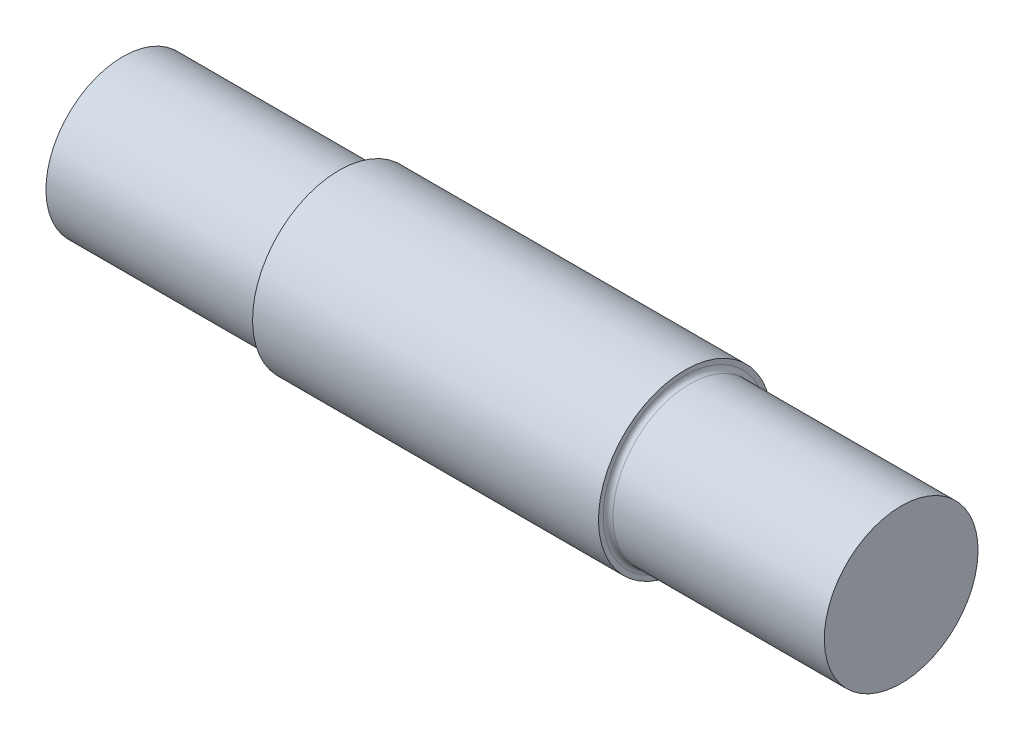
ISO-10303-21;
HEADER;
FILE_DESCRIPTION(('STEP AP214'),'2;1');
FILE_NAME('part.step','',(''),(''),'','','');
FILE_SCHEMA(('AUTOMOTIVE_DESIGN { 1 0 10303 214 1 1 1 1 }'));
ENDSEC;
DATA;
#1=APPLICATION_CONTEXT('core data for automotive mechanical design processes');
#2=APPLICATION_PROTOCOL_DEFINITION('international standard','automotive_design',2000,#1);
#3=PRODUCT_CONTEXT('',#1,'mechanical');
#4=PRODUCT('Part','Part','',(#3));
#5=PRODUCT_RELATED_PRODUCT_CATEGORY('part','',(#4));
#6=PRODUCT_DEFINITION_FORMATION('','',#4);
#7=PRODUCT_DEFINITION_CONTEXT('part definition',#1,'design');
#8=PRODUCT_DEFINITION('design','',#6,#7);
#9=PRODUCT_DEFINITION_SHAPE('','',#8);
#10=(LENGTH_UNIT() NAMED_UNIT(*) SI_UNIT(.MILLI.,.METRE.));
#11=(NAMED_UNIT(*) PLANE_ANGLE_UNIT() SI_UNIT($,.RADIAN.));
#12=(NAMED_UNIT(*) SI_UNIT($,.STERADIAN.) SOLID_ANGLE_UNIT());
#13=UNCERTAINTY_MEASURE_WITH_UNIT(LENGTH_MEASURE(1.E-05),#10,'distance_accuracy_value','');
#14=(GEOMETRIC_REPRESENTATION_CONTEXT(3) GLOBAL_UNCERTAINTY_ASSIGNED_CONTEXT((#13)) GLOBAL_UNIT_ASSIGNED_CONTEXT((#10,
#11,#12)) REPRESENTATION_CONTEXT('',''));
#15=CARTESIAN_POINT('',(0.,0.,0.));
#16=DIRECTION('',(0.,0.,1.));
#17=DIRECTION('',(1.,0.,0.));
#18=AXIS2_PLACEMENT_3D('',#15,#16,#17);
#19=CARTESIAN_POINT('',(0.,0.,0.));
#20=DIRECTION('',(-1.,0.,0.));
#21=DIRECTION('',(0.,-1.,0.));
#22=AXIS2_PLACEMENT_3D('',#19,#20,#21);
#23=PLANE('',#22);
#24=CARTESIAN_POINT('',(0.,0.,0.));
#25=DIRECTION('',(1.,0.,0.));
#26=DIRECTION('',(0.,1.,0.));
#27=AXIS2_PLACEMENT_3D('',#24,#25,#26);
#28=CIRCLE('',#27,8.);
#29=CARTESIAN_POINT('',(0.,8.,0.));
#30=VERTEX_POINT('',#29);
#31=EDGE_CURVE('E53',#30,#30,#28,.T.);
#32=ORIENTED_EDGE('',*,*,#31,.F.);
#33=EDGE_LOOP('',(#32));
#34=FACE_BOUND('',#33,.T.);
#35=ADVANCED_FACE('F33',(#34),#23,.T.);
#36=CARTESIAN_POINT('',(81.,0.,0.));
#37=DIRECTION('',(1.,0.,0.));
#38=DIRECTION('',(0.,1.,0.));
#39=AXIS2_PLACEMENT_3D('',#36,#37,#38);
#40=CYLINDRICAL_SURFACE('',#39,8.);
#41=CARTESIAN_POINT('',(22.,0.,0.));
#42=DIRECTION('',(-1.,0.,0.));
#43=DIRECTION('',(0.,-1.,0.));
#44=AXIS2_PLACEMENT_3D('',#41,#42,#43);
#45=CIRCLE('',#44,8.);
#46=CARTESIAN_POINT('',(22.,-8.,0.));
#47=VERTEX_POINT('',#46);
#48=EDGE_CURVE('E44',#47,#47,#45,.T.);
#49=ORIENTED_EDGE('',*,*,#48,.T.);
#50=EDGE_LOOP('',(#49));
#51=FACE_BOUND('',#50,.T.);
#52=ORIENTED_EDGE('',*,*,#31,.T.);
#53=EDGE_LOOP('',(#52));
#54=FACE_BOUND('',#53,.T.);
#55=ADVANCED_FACE('F81',(#51,#54),#40,.T.);
#56=CARTESIAN_POINT('',(22.5,8.,0.));
#57=DIRECTION('',(-1.,0.,0.));
#58=DIRECTION('',(0.,-1.,0.));
#59=AXIS2_PLACEMENT_3D('',#56,#57,#58);
#60=PLANE('',#59);
#61=CARTESIAN_POINT('',(22.5,0.,0.));
#62=DIRECTION('',(-1.,0.,0.));
#63=DIRECTION('',(0.,-1.,0.));
#64=AXIS2_PLACEMENT_3D('',#61,#62,#63);
#65=CIRCLE('',#64,8.5);
#66=CARTESIAN_POINT('',(22.5,-8.5,0.));
#67=VERTEX_POINT('',#66);
#68=EDGE_CURVE('E48',#67,#67,#65,.F.);
#69=ORIENTED_EDGE('',*,*,#68,.T.);
#70=EDGE_LOOP('',(#69));
#71=FACE_BOUND('',#70,.T.);
#72=CARTESIAN_POINT('',(22.5,0.,0.));
#73=DIRECTION('',(1.,0.,0.));
#74=DIRECTION('',(0.,1.,0.));
#75=AXIS2_PLACEMENT_3D('',#72,#73,#74);
#76=CIRCLE('',#75,9.);
#77=CARTESIAN_POINT('',(22.5,9.,0.));
#78=VERTEX_POINT('',#77);
#79=EDGE_CURVE('E56',#78,#78,#76,.T.);
#80=ORIENTED_EDGE('',*,*,#79,.F.);
#81=EDGE_LOOP('',(#80));
#82=FACE_BOUND('',#81,.T.);
#83=ADVANCED_FACE('F87',(#71,#82),#60,.T.);
#84=CARTESIAN_POINT('',(81.,0.,0.));
#85=DIRECTION('',(1.,0.,0.));
#86=DIRECTION('',(0.,1.,0.));
#87=AXIS2_PLACEMENT_3D('',#84,#85,#86);
#88=CYLINDRICAL_SURFACE('',#87,9.);
#89=ORIENTED_EDGE('',*,*,#79,.T.);
#90=EDGE_LOOP('',(#89));
#91=FACE_BOUND('',#90,.T.);
#92=CARTESIAN_POINT('',(58.5,0.,0.));
#93=DIRECTION('',(1.,0.,0.));
#94=DIRECTION('',(0.,1.,0.));
#95=AXIS2_PLACEMENT_3D('',#92,#93,#94);
#96=CIRCLE('',#95,9.);
#97=CARTESIAN_POINT('',(58.5,9.,0.));
#98=VERTEX_POINT('',#97);
#99=EDGE_CURVE('E59',#98,#98,#96,.T.);
#100=ORIENTED_EDGE('',*,*,#99,.F.);
#101=EDGE_LOOP('',(#100));
#102=FACE_BOUND('',#101,.T.);
#103=ADVANCED_FACE('F78',(#91,#102),#88,.T.);
#104=CARTESIAN_POINT('',(58.5,9.,0.));
#105=DIRECTION('',(1.,0.,0.));
#106=DIRECTION('',(0.,1.,0.));
#107=AXIS2_PLACEMENT_3D('',#104,#105,#106);
#108=PLANE('',#107);
#109=CARTESIAN_POINT('',(58.5,0.,0.));
#110=DIRECTION('',(1.,0.,0.));
#111=DIRECTION('',(0.,1.,0.));
#112=AXIS2_PLACEMENT_3D('',#109,#110,#111);
#113=CIRCLE('',#112,8.5);
#114=CARTESIAN_POINT('',(58.5,8.5,0.));
#115=VERTEX_POINT('',#114);
#116=EDGE_CURVE('E10',#115,#115,#113,.F.);
#117=ORIENTED_EDGE('',*,*,#116,.T.);
#118=EDGE_LOOP('',(#117));
#119=FACE_BOUND('',#118,.T.);
#120=ORIENTED_EDGE('',*,*,#99,.T.);
#121=EDGE_LOOP('',(#120));
#122=FACE_BOUND('',#121,.T.);
#123=ADVANCED_FACE('F70',(#119,#122),#108,.T.);
#124=CARTESIAN_POINT('',(81.,0.,0.));
#125=DIRECTION('',(1.,0.,0.));
#126=DIRECTION('',(0.,1.,0.));
#127=AXIS2_PLACEMENT_3D('',#124,#125,#126);
#128=CYLINDRICAL_SURFACE('',#127,8.);
#129=CARTESIAN_POINT('',(59.,0.,0.));
#130=DIRECTION('',(1.,0.,0.));
#131=DIRECTION('',(0.,1.,0.));
#132=AXIS2_PLACEMENT_3D('',#129,#130,#131);
#133=CIRCLE('',#132,8.);
#134=CARTESIAN_POINT('',(59.,8.,0.));
#135=VERTEX_POINT('',#134);
#136=EDGE_CURVE('E40',#135,#135,#133,.T.);
#137=ORIENTED_EDGE('',*,*,#136,.T.);
#138=EDGE_LOOP('',(#137));
#139=FACE_BOUND('',#138,.T.);
#140=CARTESIAN_POINT('',(81.,0.,0.));
#141=DIRECTION('',(1.,0.,0.));
#142=DIRECTION('',(0.,1.,0.));
#143=AXIS2_PLACEMENT_3D('',#140,#141,#142);
#144=CIRCLE('',#143,8.);
#145=CARTESIAN_POINT('',(81.,8.,0.));
#146=VERTEX_POINT('',#145);
#147=EDGE_CURVE('E62',#146,#146,#144,.T.);
#148=ORIENTED_EDGE('',*,*,#147,.F.);
#149=EDGE_LOOP('',(#148));
#150=FACE_BOUND('',#149,.T.);
#151=ADVANCED_FACE('F68',(#139,#150),#128,.T.);
#152=CARTESIAN_POINT('',(81.,8.,0.));
#153=DIRECTION('',(1.,0.,0.));
#154=DIRECTION('',(0.,1.,0.));
#155=AXIS2_PLACEMENT_3D('',#152,#153,#154);
#156=PLANE('',#155);
#157=ORIENTED_EDGE('',*,*,#147,.T.);
#158=EDGE_LOOP('',(#157));
#159=FACE_BOUND('',#158,.T.);
#160=ADVANCED_FACE('F66',(#159),#156,.T.);
#161=CARTESIAN_POINT('',(22.,0.,0.));
#162=DIRECTION('',(-1.,0.,0.));
#163=DIRECTION('',(0.,-1.,0.));
#164=AXIS2_PLACEMENT_3D('',#161,#162,#163);
#165=TOROIDAL_SURFACE('',#164,8.5,0.5);
#166=ORIENTED_EDGE('',*,*,#48,.F.);
#167=EDGE_LOOP('',(#166));
#168=FACE_BOUND('',#167,.T.);
#169=ORIENTED_EDGE('',*,*,#68,.F.);
#170=EDGE_LOOP('',(#169));
#171=FACE_BOUND('',#170,.T.);
#172=ADVANCED_FACE('F76',(#168,#171),#165,.F.);
#173=CARTESIAN_POINT('',(59.,0.,0.));
#174=DIRECTION('',(1.,0.,0.));
#175=DIRECTION('',(0.,1.,0.));
#176=AXIS2_PLACEMENT_3D('',#173,#174,#175);
#177=TOROIDAL_SURFACE('',#176,8.5,0.5);
#178=ORIENTED_EDGE('',*,*,#116,.F.);
#179=EDGE_LOOP('',(#178));
#180=FACE_BOUND('',#179,.T.);
#181=ORIENTED_EDGE('',*,*,#136,.F.);
#182=EDGE_LOOP('',(#181));
#183=FACE_BOUND('',#182,.T.);
#184=ADVANCED_FACE('F35',(#180,#183),#177,.F.);
#185=CLOSED_SHELL('',(#35,#55,#83,#103,#123,#151,#160,#172,#184));
#186=MANIFOLD_SOLID_BREP('B2',#185);
#187=ADVANCED_BREP_SHAPE_REPRESENTATION('',(#18,#186),#14);
#188=SHAPE_DEFINITION_REPRESENTATION(#9,#187);
ENDSEC;
END-ISO-10303-21;
